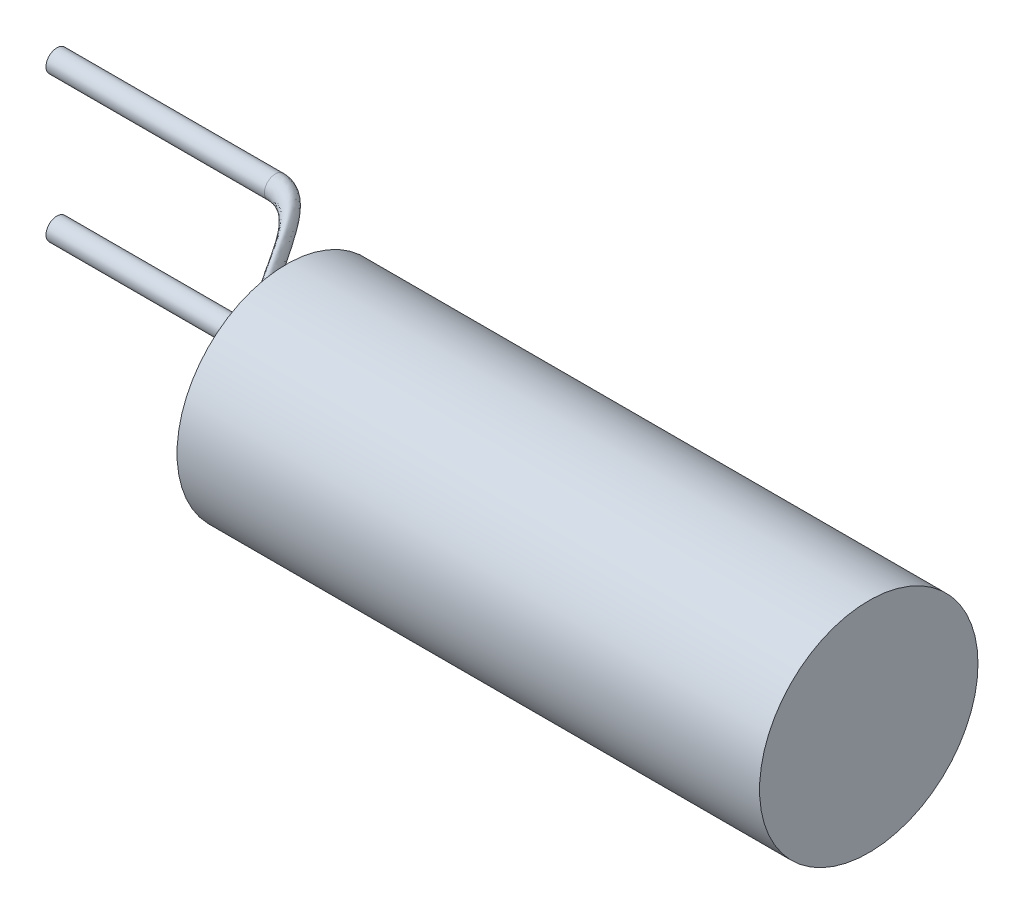
ISO-10303-21;
HEADER;
FILE_DESCRIPTION(('STEP AP214'),'2;1');
FILE_NAME('part.step','',(''),(''),'','','');
FILE_SCHEMA(('AUTOMOTIVE_DESIGN { 1 0 10303 214 1 1 1 1 }'));
ENDSEC;
DATA;
#1=APPLICATION_CONTEXT('core data for automotive mechanical design processes');
#2=APPLICATION_PROTOCOL_DEFINITION('international standard','automotive_design',2000,#1);
#3=PRODUCT_CONTEXT('',#1,'mechanical');
#4=PRODUCT('Part','Part','',(#3));
#5=PRODUCT_RELATED_PRODUCT_CATEGORY('part','',(#4));
#6=PRODUCT_DEFINITION_FORMATION('','',#4);
#7=PRODUCT_DEFINITION_CONTEXT('part definition',#1,'design');
#8=PRODUCT_DEFINITION('design','',#6,#7);
#9=PRODUCT_DEFINITION_SHAPE('','',#8);
#10=(LENGTH_UNIT() NAMED_UNIT(*) SI_UNIT(.MILLI.,.METRE.));
#11=(NAMED_UNIT(*) PLANE_ANGLE_UNIT() SI_UNIT($,.RADIAN.));
#12=(NAMED_UNIT(*) SI_UNIT($,.STERADIAN.) SOLID_ANGLE_UNIT());
#13=UNCERTAINTY_MEASURE_WITH_UNIT(LENGTH_MEASURE(1.E-05),#10,'distance_accuracy_value','');
#14=(GEOMETRIC_REPRESENTATION_CONTEXT(3) GLOBAL_UNCERTAINTY_ASSIGNED_CONTEXT((#13)) GLOBAL_UNIT_ASSIGNED_CONTEXT((#10,
#11,#12)) REPRESENTATION_CONTEXT('',''));
#15=CARTESIAN_POINT('',(0.,0.,0.));
#16=DIRECTION('',(0.,0.,1.));
#17=DIRECTION('',(1.,0.,0.));
#18=AXIS2_PLACEMENT_3D('',#15,#16,#17);
#19=CARTESIAN_POINT('',(-8.5,-1.,0.15));
#20=DIRECTION('',(1.,0.,0.));
#21=DIRECTION('',(0.,0.,-1.));
#22=AXIS2_PLACEMENT_3D('',#19,#20,#21);
#23=CYLINDRICAL_SURFACE('',#22,0.15);
#24=CARTESIAN_POINT('',(-8.5,-1.,0.15));
#25=DIRECTION('',(1.,0.,0.));
#26=DIRECTION('',(0.,0.,-1.));
#27=AXIS2_PLACEMENT_3D('',#24,#25,#26);
#28=CIRCLE('',#27,0.15);
#29=CARTESIAN_POINT('',(-8.5,-1.,0.));
#30=VERTEX_POINT('',#29);
#31=EDGE_CURVE('E11',#30,#30,#28,.T.);
#32=ORIENTED_EDGE('',*,*,#31,.T.);
#33=EDGE_LOOP('',(#32));
#34=FACE_BOUND('',#33,.T.);
#35=CARTESIAN_POINT('',(-5.5,-0.850014330437405,0.147926614878967));
#36=CARTESIAN_POINT('',(-5.5,-0.849957113818923,0.152065581994215));
#37=CARTESIAN_POINT('',(-5.5,-0.850179788616337,0.160270296413231));
#38=CARTESIAN_POINT('',(-5.5,-0.85148693526129,0.172318448293309));
#39=CARTESIAN_POINT('',(-5.5,-0.853729026700765,0.184068420110933));
#40=CARTESIAN_POINT('',(-5.5,-0.872562106178904,0.252543608757904));
#41=CARTESIAN_POINT('',(-5.5,-0.931703141034997,0.299070203666875));
#42=CARTESIAN_POINT('',(-5.5,-1.08070595718393,0.301130001932244));
#43=CARTESIAN_POINT('',(-5.5,-1.14884133719295,0.234852727425996));
#44=CARTESIAN_POINT('',(-5.5,-1.15113000193224,0.069294042816071));
#45=CARTESIAN_POINT('',(-5.5,-1.084852727426,0.0011586628070547));
#46=CARTESIAN_POINT('',(-5.5,-0.935849911277064,-0.000901135458314405));
#47=CARTESIAN_POINT('',(-5.5,-0.875445364679089,0.0439728747030943));
#48=CARTESIAN_POINT('',(-5.5,-0.854726656844276,0.111901303865882));
#49=CARTESIAN_POINT('',(-5.5,-0.852160623644375,0.12358480870625));
#50=CARTESIAN_POINT('',(-5.5,-0.85052093553105,0.135592223872216));
#51=CARTESIAN_POINT('',(-5.5,-0.850071547055888,0.143787647763719));
#52=CARTESIAN_POINT('',(-5.5,-0.850014330437405,0.147926614878967));
#53=B_SPLINE_CURVE_WITH_KNOTS('',3,(#35,#36,#37,#38,#39,#40,#41,#42,#43,#44,#45,#46,#47,#48,#49,
#50,#51,#52),.UNSPECIFIED.,.T.,.F.,(4,1,1,1,1,2,2,2,1,1,1,1,4),(0.,0.0125,0.0249999999999999,
0.0375000000000001,0.05,0.25,0.5,0.75,0.95,0.9625,0.975,0.9875,1.),.UNSPECIFIED.);
#54=CARTESIAN_POINT('',(-5.5,-0.850014330437405,0.147926614878967));
#55=VERTEX_POINT('',#54);
#56=EDGE_CURVE('E116',#55,#55,#53,.T.);
#57=ORIENTED_EDGE('',*,*,#56,.F.);
#58=EDGE_LOOP('',(#57));
#59=FACE_BOUND('',#58,.T.);
#60=ADVANCED_FACE('F107',(#34,#59),#23,.T.);
#61=CARTESIAN_POINT('',(-8.5,-1.,0.15));
#62=DIRECTION('',(1.,0.,0.));
#63=DIRECTION('',(0.,0.,-1.));
#64=AXIS2_PLACEMENT_3D('',#61,#62,#63);
#65=PLANE('',#64);
#66=ORIENTED_EDGE('',*,*,#31,.F.);
#67=EDGE_LOOP('',(#66));
#68=FACE_BOUND('',#67,.T.);
#69=ADVANCED_FACE('F153',(#68),#65,.F.);
#70=CARTESIAN_POINT('',(-5.5,-0.850014330437405,0.147926614878967));
#71=CARTESIAN_POINT('',(-4.86123588419275,-0.850014330437405,0.147926614878967));
#72=CARTESIAN_POINT('',(-4.73876411580726,-0.445545419311715,1.39234666482995));
#73=CARTESIAN_POINT('',(-4.1,-0.445545419311715,1.39234666482995));
#74=CARTESIAN_POINT('',(-5.5,-0.849957113818923,0.152065581994215));
#75=CARTESIAN_POINT('',(-4.86130251137473,-0.849957113818923,0.152065581994215));
#76=CARTESIAN_POINT('',(-4.73869748862527,-0.442574644734284,1.39522916737681));
#77=CARTESIAN_POINT('',(-4.1,-0.442574644734284,1.39522916737681));
#78=CARTESIAN_POINT('',(-5.5,-0.850179788616337,0.160270296413231));
#79=CARTESIAN_POINT('',(-4.86137207730885,-0.850179788616337,0.160270296413231));
#80=CARTESIAN_POINT('',(-4.73862792269115,-0.436923006467813,1.40118113408269));
#81=CARTESIAN_POINT('',(-4.1,-0.436923006467813,1.40118113408269));
#82=CARTESIAN_POINT('',(-5.5,-0.85148693526129,0.172318448293309));
#83=CARTESIAN_POINT('',(-4.86128808028679,-0.85148693526129,0.172318448293309));
#84=CARTESIAN_POINT('',(-4.73871191971321,-0.429316107623629,1.41061520457486));
#85=CARTESIAN_POINT('',(-4.1,-0.429316107623629,1.41061520457486));
#86=CARTESIAN_POINT('',(-5.5,-0.853729026700765,0.184068420110933));
#87=CARTESIAN_POINT('',(-4.86102186682558,-0.853729026700765,0.184068420110933));
#88=CARTESIAN_POINT('',(-4.73897813317443,-0.422580593225315,1.42050063109717));
#89=CARTESIAN_POINT('',(-4.1,-0.422580593225315,1.42050063109717));
#90=CARTESIAN_POINT('',(-5.5,-0.872562106178904,0.252543608757904));
#91=CARTESIAN_POINT('',(-4.85841624381571,-0.872562106178904,0.252543608757904));
#92=CARTESIAN_POINT('',(-4.74158375618426,-0.387400768852726,1.48219273999274));
#93=CARTESIAN_POINT('',(-4.1,-0.387400768852726,1.48219273999274));
#94=CARTESIAN_POINT('',(-5.5,-0.931703141034997,0.299070203666875));
#95=CARTESIAN_POINT('',(-4.84685125030273,-0.931703141034997,0.299070203666875));
#96=CARTESIAN_POINT('',(-4.75314874969727,-0.396226624080282,1.55692218744938));
#97=CARTESIAN_POINT('',(-4.1,-0.396226624080282,1.55692218744938));
#98=CARTESIAN_POINT('',(-5.5,-1.08070595718393,0.301130001932244));
#99=CARTESIAN_POINT('',(-4.82201351547943,-1.08070595718393,0.301130001932244));
#100=CARTESIAN_POINT('',(-4.77798648452058,-0.49999671576704,1.66387007223692));
#101=CARTESIAN_POINT('',(-4.1,-0.49999671576704,1.66387007223692));
#102=CARTESIAN_POINT('',(-5.5,-1.14884133719295,0.234852727425996));
#103=CARTESIAN_POINT('',(-4.80797369035177,-1.14884133719295,0.234852727425996));
#104=CARTESIAN_POINT('',(-4.79202630964824,-0.595039089139653,1.66530338610714));
#105=CARTESIAN_POINT('',(-4.1,-0.595039089139653,1.66530338610714));
#106=CARTESIAN_POINT('',(-5.5,-1.15113000193224,0.069294042816071));
#107=CARTESIAN_POINT('',(-4.80570198475555,-1.15113000193224,0.069294042816071));
#108=CARTESIAN_POINT('',(-4.79429801524445,-0.713870072236917,1.55000328423296));
#109=CARTESIAN_POINT('',(-4.1,-0.713870072236916,1.55000328423296));
#110=CARTESIAN_POINT('',(-5.5,-1.084852727426,0.0011586628070547));
#111=CARTESIAN_POINT('',(-4.817470104287,-1.084852727426,0.0011586628070547));
#112=CARTESIAN_POINT('',(-4.782529895713,-0.715303386107136,1.45496091086035));
#113=CARTESIAN_POINT('',(-4.1,-0.715303386107136,1.45496091086035));
#114=CARTESIAN_POINT('',(-5.5,-0.935849911277064,-0.000901135458314405));
#115=CARTESIAN_POINT('',(-4.84211046922617,-0.935849911277064,-0.000901135458314405));
#116=CARTESIAN_POINT('',(-4.75788953077383,-0.611533294420378,1.34801302607281));
#117=CARTESIAN_POINT('',(-4.1,-0.611533294420378,1.34801302607281));
#118=CARTESIAN_POINT('',(-5.5,-0.875445364679089,0.0439728747030943));
#119=CARTESIAN_POINT('',(-4.85505245814308,-0.875445364679089,0.0439728747030943));
#120=CARTESIAN_POINT('',(-4.74494754185693,-0.537103971867696,1.33693773907779));
#121=CARTESIAN_POINT('',(-4.1,-0.537103971867696,1.33693773907779));
#122=CARTESIAN_POINT('',(-5.5,-0.854726656844276,0.111901303865882));
#123=CARTESIAN_POINT('',(-4.85985516259025,-0.854726656844276,0.111901303865882));
#124=CARTESIAN_POINT('',(-4.74014483740975,-0.47437908021438,1.37024125705935));
#125=CARTESIAN_POINT('',(-4.1,-0.47437908021438,1.37024125705935));
#126=CARTESIAN_POINT('',(-5.5,-0.852160623644375,0.12358480870625));
#127=CARTESIAN_POINT('',(-4.86049972815062,-0.852160623644375,0.12358480870625));
#128=CARTESIAN_POINT('',(-4.73950027184938,-0.46429504162327,1.37667561619068));
#129=CARTESIAN_POINT('',(-4.1,-0.46429504162327,1.37667561619068));
#130=CARTESIAN_POINT('',(-5.5,-0.85052093553105,0.135592223872216));
#131=CARTESIAN_POINT('',(-4.86097231421695,-0.850520935531049,0.135592223872216));
#132=CARTESIAN_POINT('',(-4.73902768578304,-0.45463587745313,1.38399457401343));
#133=CARTESIAN_POINT('',(-4.1,-0.45463587745313,1.38399457401343));
#134=CARTESIAN_POINT('',(-5.5,-0.850071547055888,0.143787647763719));
#135=CARTESIAN_POINT('',(-4.86116925701076,-0.850071547055888,0.143787647763719));
#136=CARTESIAN_POINT('',(-4.73883074298924,-0.448516193889147,1.3894641622831));
#137=CARTESIAN_POINT('',(-4.1,-0.448516193889147,1.3894641622831));
#138=CARTESIAN_POINT('',(-5.5,-0.850014330437405,0.147926614878967));
#139=CARTESIAN_POINT('',(-4.86123588419275,-0.850014330437405,0.147926614878967));
#140=CARTESIAN_POINT('',(-4.73876411580726,-0.445545419311715,1.39234666482995));
#141=CARTESIAN_POINT('',(-4.1,-0.445545419311715,1.39234666482995));
#142=B_SPLINE_SURFACE_WITH_KNOTS('',3,3,((#70,#71,#72,#73),(#74,#75,#76,#77),(#78,#79,#80,#81),
(#82,#83,#84,#85),(#86,#87,#88,#89),(#90,#91,#92,#93),(#94,#95,#96,#97),(#98,#99,#100,#101),
(#102,#103,#104,#105),(#106,#107,#108,#109),(#110,#111,#112,#113),(#114,#115,#116,#117),(#118,
#119,#120,#121),(#122,#123,#124,#125),(#126,#127,#128,#129),(#130,#131,#132,#133),(#134,#135,
#136,#137),(#138,#139,#140,#141)),.UNSPECIFIED.,.T.,.F.,.F.,(4,1,1,1,1,2,2,2,1,1,1,1,4),(4,4),
(0.,0.0125,0.0249999999999999,0.0375000000000001,0.05,0.25,0.5,0.75,0.95,0.9625,0.975,0.9875,
1.),(0.,1.),.UNSPECIFIED.);
#143=CARTESIAN_POINT('',(-4.1,-0.445545419311715,1.39234666482995));
#144=CARTESIAN_POINT('',(-4.1,-0.448516193889147,1.3894641622831));
#145=CARTESIAN_POINT('',(-4.1,-0.45463587745313,1.38399457401343));
#146=CARTESIAN_POINT('',(-4.1,-0.46429504162327,1.37667561619068));
#147=CARTESIAN_POINT('',(-4.1,-0.47437908021438,1.37024125705935));
#148=CARTESIAN_POINT('',(-4.1,-0.537103971867696,1.33693773907779));
#149=CARTESIAN_POINT('',(-4.1,-0.611533294420378,1.34801302607281));
#150=CARTESIAN_POINT('',(-4.1,-0.715303386107136,1.45496091086035));
#151=CARTESIAN_POINT('',(-4.1,-0.713870072236916,1.55000328423296));
#152=CARTESIAN_POINT('',(-4.1,-0.595039089139653,1.66530338610714));
#153=CARTESIAN_POINT('',(-4.1,-0.49999671576704,1.66387007223692));
#154=CARTESIAN_POINT('',(-4.1,-0.396226624080282,1.55692218744938));
#155=CARTESIAN_POINT('',(-4.1,-0.387400768852726,1.48219273999274));
#156=CARTESIAN_POINT('',(-4.1,-0.422580593225315,1.42050063109717));
#157=CARTESIAN_POINT('',(-4.1,-0.429316107623629,1.41061520457486));
#158=CARTESIAN_POINT('',(-4.1,-0.436923006467813,1.40118113408269));
#159=CARTESIAN_POINT('',(-4.1,-0.442574644734284,1.39522916737681));
#160=CARTESIAN_POINT('',(-4.1,-0.445545419311715,1.39234666482995));
#161=B_SPLINE_CURVE_WITH_KNOTS('',3,(#143,#144,#145,#146,#147,#148,#149,#150,#151,#152,#153,
#154,#155,#156,#157,#158,#159,#160),.UNSPECIFIED.,.T.,.F.,(4,1,1,1,1,2,2,2,1,1,1,1,4),(0.,
0.0125,0.025,0.0375,0.05,0.25,0.5,0.75,0.95,0.9625,0.975,0.9875,1.),.UNSPECIFIED.);
#162=CARTESIAN_POINT('',(-4.1,-0.445545419311715,1.39234666482995));
#163=VERTEX_POINT('',#162);
#164=EDGE_CURVE('E318',#163,#163,#161,.T.);
#165=ORIENTED_EDGE('',*,*,#56,.T.);
#166=EDGE_LOOP('',(#165));
#167=FACE_BOUND('',#166,.T.);
#168=ORIENTED_EDGE('',*,*,#164,.T.);
#169=EDGE_LOOP('',(#168));
#170=FACE_BOUND('',#169,.T.);
#171=ADVANCED_FACE('F131',(#167,#170),#142,.T.);
#172=CARTESIAN_POINT('',(-8.5,1.,0.15));
#173=DIRECTION('',(1.,0.,0.));
#174=DIRECTION('',(0.,0.,-1.));
#175=AXIS2_PLACEMENT_3D('',#172,#173,#174);
#176=CYLINDRICAL_SURFACE('',#175,0.15);
#177=CARTESIAN_POINT('',(-8.5,1.,0.15));
#178=DIRECTION('',(1.,0.,0.));
#179=DIRECTION('',(0.,0.,-1.));
#180=AXIS2_PLACEMENT_3D('',#177,#178,#179);
#181=CIRCLE('',#180,0.15);
#182=CARTESIAN_POINT('',(-8.5,1.,0.));
#183=VERTEX_POINT('',#182);
#184=EDGE_CURVE('E299',#183,#183,#181,.T.);
#185=ORIENTED_EDGE('',*,*,#184,.T.);
#186=EDGE_LOOP('',(#185));
#187=FACE_BOUND('',#186,.T.);
#188=CARTESIAN_POINT('',(-5.5,0.857695064202424,0.102573158995693));
#189=CARTESIAN_POINT('',(-5.5,0.8590038434736,0.0986461474930519));
#190=CARTESIAN_POINT('',(-5.5,0.861915603895461,0.0909722583872137));
#191=CARTESIAN_POINT('',(-5.5,0.867116863086403,0.0800263231185634));
#192=CARTESIAN_POINT('',(-5.5,0.873102753755113,0.069669782931794));
#193=CARTESIAN_POINT('',(-5.5,0.913431964151697,0.011213892453107));
#194=CARTESIAN_POINT('',(-5.5,0.984594656962047,-0.0132454041363866));
#195=CARTESIAN_POINT('',(-5.5,1.12596707105713,0.0338706496259374));
#196=CARTESIAN_POINT('',(-5.5,1.16848052122109,0.118886610951482));
#197=CARTESIAN_POINT('',(-5.5,1.11612935037406,0.275967071057132));
#198=CARTESIAN_POINT('',(-5.5,1.03111338904852,0.318480521221089));
#199=CARTESIAN_POINT('',(-5.5,0.889740974953433,0.271364467458765));
#200=CARTESIAN_POINT('',(-5.5,0.847479989732962,0.209103764235398));
#201=CARTESIAN_POINT('',(-5.5,0.850282851307933,0.138141236730667));
#202=CARTESIAN_POINT('',(-5.5,0.851706840362252,0.126264323541159));
#203=CARTESIAN_POINT('',(-5.5,0.854112171566834,0.114386572159981));
#204=CARTESIAN_POINT('',(-5.5,0.856386284931248,0.106500170498334));
#205=CARTESIAN_POINT('',(-5.5,0.857695064202424,0.102573158995693));
#206=B_SPLINE_CURVE_WITH_KNOTS('',3,(#188,#189,#190,#191,#192,#193,#194,#195,#196,#197,#198,
#199,#200,#201,#202,#203,#204,#205),.UNSPECIFIED.,.T.,.F.,(4,1,1,1,1,2,2,2,1,1,1,1,4),(0.,
0.0125,0.0249999999999999,0.0375000000000001,0.05,0.25,0.5,0.75,0.95,0.9625,0.975,0.9875,1.),.UNSPECIFIED.);
#207=CARTESIAN_POINT('',(-5.5,0.857695064202424,0.102573158995693));
#208=VERTEX_POINT('',#207);
#209=EDGE_CURVE('E276',#208,#208,#206,.T.);
#210=ORIENTED_EDGE('',*,*,#209,.F.);
#211=EDGE_LOOP('',(#210));
#212=FACE_BOUND('',#211,.T.);
#213=ADVANCED_FACE('F152',(#187,#212),#176,.T.);
#214=CARTESIAN_POINT('',(-8.5,1.,0.15));
#215=DIRECTION('',(1.,0.,0.));
#216=DIRECTION('',(0.,0.,-1.));
#217=AXIS2_PLACEMENT_3D('',#214,#215,#216);
#218=PLANE('',#217);
#219=ORIENTED_EDGE('',*,*,#184,.F.);
#220=EDGE_LOOP('',(#219));
#221=FACE_BOUND('',#220,.T.);
#222=ADVANCED_FACE('F187',(#221),#218,.F.);
#223=CARTESIAN_POINT('',(-5.5,0.857695064202424,0.102573158995693));
#224=CARTESIAN_POINT('',(-4.85972026914232,0.857695064202424,0.102573158995693));
#225=CARTESIAN_POINT('',(-4.74027973085767,0.48630371252887,1.36419579180896));
#226=CARTESIAN_POINT('',(-4.1,0.48630371252887,1.36419579180896));
#227=CARTESIAN_POINT('',(-5.5,0.8590038434736,0.0986461474930519));
#228=CARTESIAN_POINT('',(-4.8594042488723,0.8590038434736,0.0986461474930519));
#229=CARTESIAN_POINT('',(-4.7405957511277,0.490051331574438,1.36243804495238));
#230=CARTESIAN_POINT('',(-4.1,0.490051331574438,1.36243804495238));
#231=CARTESIAN_POINT('',(-5.5,0.861915603895461,0.0909722583872137));
#232=CARTESIAN_POINT('',(-4.85871236287622,0.861915603895461,0.0909722583872137));
#233=CARTESIAN_POINT('',(-4.74128763712379,0.497618773649112,1.35925987830957));
#234=CARTESIAN_POINT('',(-4.1,0.497618773649112,1.35925987830957));
#235=CARTESIAN_POINT('',(-5.5,0.867116863086403,0.0800263231185634));
#236=CARTESIAN_POINT('',(-4.85752925518339,0.867116863086403,0.0800263231185634));
#237=CARTESIAN_POINT('',(-4.74247074481661,0.509135039433844,1.35548599192386));
#238=CARTESIAN_POINT('',(-4.1,0.509135039433844,1.35548599192386));
#239=CARTESIAN_POINT('',(-5.5,0.873102753755113,0.069669782931794));
#240=CARTESIAN_POINT('',(-4.85620380680294,0.873102753755113,0.069669782931794));
#241=CARTESIAN_POINT('',(-4.74379619319707,0.520764898613399,1.35268685148407));
#242=CARTESIAN_POINT('',(-4.1,0.520764898613399,1.35268685148407));
#243=CARTESIAN_POINT('',(-5.5,0.913431964151697,0.011213892453107));
#244=CARTESIAN_POINT('',(-4.84751050614758,0.913431964151697,0.011213892453107));
#245=CARTESIAN_POINT('',(-4.75248949385243,0.590916558392295,1.34162877872549));
#246=CARTESIAN_POINT('',(-4.1,0.590916558392295,1.34162877872549));
#247=CARTESIAN_POINT('',(-5.5,0.984594656962047,-0.0132454041363866));
#248=CARTESIAN_POINT('',(-4.83267611813924,0.984594656962047,-0.0132454041363866));
#249=CARTESIAN_POINT('',(-4.76732388186076,0.657680258485685,1.37634180779978));
#250=CARTESIAN_POINT('',(-4.1,0.657680258485685,1.37634180779978));
#251=CARTESIAN_POINT('',(-5.5,1.12596707105713,0.0338706496259374));
#252=CARTESIAN_POINT('',(-4.80966226486195,1.12596707105713,0.0338706496259374));
#253=CARTESIAN_POINT('',(-4.79033773513805,0.720959145322733,1.51125609344023));
#254=CARTESIAN_POINT('',(-4.1,0.720959145322733,1.51125609344023));
#255=CARTESIAN_POINT('',(-5.5,1.16848052122109,0.118886610951482));
#256=CARTESIAN_POINT('',(-4.80271022474818,1.16848052122109,0.118886610951482));
#257=CARTESIAN_POINT('',(-4.79728977525181,0.688648668382486,1.60064927105935));
#258=CARTESIAN_POINT('',(-4.1,0.688648668382486,1.60064927105935));
#259=CARTESIAN_POINT('',(-5.5,1.11612935037406,0.275967071057132));
#260=CARTESIAN_POINT('',(-4.81351770771395,1.11612935037406,0.275967071057132));
#261=CARTESIAN_POINT('',(-4.78648229228606,0.538743906559774,1.67095914532273));
#262=CARTESIAN_POINT('',(-4.1,0.538743906559774,1.67095914532273));
#263=CARTESIAN_POINT('',(-5.5,1.03111338904852,0.318480521221089));
#264=CARTESIAN_POINT('',(-4.83127723079347,1.03111338904852,0.318480521221089));
#265=CARTESIAN_POINT('',(-4.76872276920655,0.449350728940654,1.63864866838249));
#266=CARTESIAN_POINT('',(-4.1,0.449350728940654,1.63864866838249));
#267=CARTESIAN_POINT('',(-5.5,0.889740974953433,0.271364467458765));
#268=CARTESIAN_POINT('',(-4.85520577243425,0.889740974953433,0.271364467458765));
#269=CARTESIAN_POINT('',(-4.74479422756575,0.386071842103606,1.50373438274205));
#270=CARTESIAN_POINT('',(-4.1,0.386071842103606,1.50373438274205));
#271=CARTESIAN_POINT('',(-5.5,0.847479989732962,0.209103764235398));
#272=CARTESIAN_POINT('',(-4.86346855713484,0.847479989732962,0.209103764235398));
#273=CARTESIAN_POINT('',(-4.73653144286514,0.402066627110585,1.43020511720611));
#274=CARTESIAN_POINT('',(-4.1,0.402066627110586,1.43020511720611));
#275=CARTESIAN_POINT('',(-5.5,0.850282851307933,0.138141236730667));
#276=CARTESIAN_POINT('',(-4.86173803220626,0.850282851307933,0.138141236730667));
#277=CARTESIAN_POINT('',(-4.73826196779374,0.455421335407184,1.38333496203832));
#278=CARTESIAN_POINT('',(-4.1,0.455421335407184,1.38333496203832));
#279=CARTESIAN_POINT('',(-5.5,0.851706840362252,0.126264323541159));
#280=CARTESIAN_POINT('',(-4.8612685936104,0.851706840362252,0.126264323541159));
#281=CARTESIAN_POINT('',(-4.7387314063896,0.465009268247244,1.37618231528398));
#282=CARTESIAN_POINT('',(-4.1,0.465009268247244,1.37618231528398));
#283=CARTESIAN_POINT('',(-5.5,0.854112171566834,0.114386572159981));
#284=CARTESIAN_POINT('',(-4.86060848449638,0.854112171566835,0.114386572159981));
#285=CARTESIAN_POINT('',(-4.73939151550362,0.475274064912022,1.36974022358115));
#286=CARTESIAN_POINT('',(-4.1,0.475274064912022,1.36974022358115));
#287=CARTESIAN_POINT('',(-5.5,0.856386284931248,0.106500170498334));
#288=CARTESIAN_POINT('',(-4.86003628941235,0.856386284931248,0.106500170498334));
#289=CARTESIAN_POINT('',(-4.73996371058765,0.482556093483302,1.36595353866555));
#290=CARTESIAN_POINT('',(-4.1,0.482556093483302,1.36595353866555));
#291=CARTESIAN_POINT('',(-5.5,0.857695064202424,0.102573158995693));
#292=CARTESIAN_POINT('',(-4.85972026914232,0.857695064202424,0.102573158995693));
#293=CARTESIAN_POINT('',(-4.74027973085767,0.48630371252887,1.36419579180896));
#294=CARTESIAN_POINT('',(-4.1,0.48630371252887,1.36419579180896));
#295=B_SPLINE_SURFACE_WITH_KNOTS('',3,3,((#223,#224,#225,#226),(#227,#228,#229,#230),(#231,#232,
#233,#234),(#235,#236,#237,#238),(#239,#240,#241,#242),(#243,#244,#245,#246),(#247,#248,#249,
#250),(#251,#252,#253,#254),(#255,#256,#257,#258),(#259,#260,#261,#262),(#263,#264,#265,#266),
(#267,#268,#269,#270),(#271,#272,#273,#274),(#275,#276,#277,#278),(#279,#280,#281,#282),(#283,
#284,#285,#286),(#287,#288,#289,#290),(#291,#292,#293,#294)),.UNSPECIFIED.,.T.,.F.,.F.,(4,1,1,1,
1,2,2,2,1,1,1,1,4),(4,4),(0.,0.0125,0.0249999999999999,0.0375000000000001,0.05,0.25,0.5,0.75,
0.95,0.9625,0.975,0.9875,1.),(0.,1.),.UNSPECIFIED.);
#296=CARTESIAN_POINT('',(-4.1,0.48630371252887,1.36419579180896));
#297=CARTESIAN_POINT('',(-4.1,0.482556093483302,1.36595353866555));
#298=CARTESIAN_POINT('',(-4.1,0.475274064912022,1.36974022358115));
#299=CARTESIAN_POINT('',(-4.1,0.465009268247244,1.37618231528398));
#300=CARTESIAN_POINT('',(-4.1,0.455421335407184,1.38333496203832));
#301=CARTESIAN_POINT('',(-4.1,0.402066627110586,1.43020511720611));
#302=CARTESIAN_POINT('',(-4.1,0.386071842103606,1.50373438274205));
#303=CARTESIAN_POINT('',(-4.1,0.449350728940654,1.63864866838249));
#304=CARTESIAN_POINT('',(-4.1,0.538743906559774,1.67095914532273));
#305=CARTESIAN_POINT('',(-4.1,0.688648668382486,1.60064927105935));
#306=CARTESIAN_POINT('',(-4.1,0.720959145322733,1.51125609344023));
#307=CARTESIAN_POINT('',(-4.1,0.657680258485685,1.37634180779978));
#308=CARTESIAN_POINT('',(-4.1,0.590916558392295,1.34162877872549));
#309=CARTESIAN_POINT('',(-4.1,0.520764898613399,1.35268685148407));
#310=CARTESIAN_POINT('',(-4.1,0.509135039433844,1.35548599192386));
#311=CARTESIAN_POINT('',(-4.1,0.497618773649112,1.35925987830957));
#312=CARTESIAN_POINT('',(-4.1,0.490051331574438,1.36243804495238));
#313=CARTESIAN_POINT('',(-4.1,0.48630371252887,1.36419579180896));
#314=B_SPLINE_CURVE_WITH_KNOTS('',3,(#296,#297,#298,#299,#300,#301,#302,#303,#304,#305,#306,
#307,#308,#309,#310,#311,#312,#313),.UNSPECIFIED.,.T.,.F.,(4,1,1,1,1,2,2,2,1,1,1,1,4),(0.,
0.0125,0.025,0.0375,0.05,0.25,0.5,0.75,0.95,0.9625,0.975,0.9875,1.),.UNSPECIFIED.);
#315=CARTESIAN_POINT('',(-4.1,0.48630371252887,1.36419579180896));
#316=VERTEX_POINT('',#315);
#317=EDGE_CURVE('E319',#316,#316,#314,.T.);
#318=ORIENTED_EDGE('',*,*,#209,.T.);
#319=EDGE_LOOP('',(#318));
#320=FACE_BOUND('',#319,.T.);
#321=ORIENTED_EDGE('',*,*,#317,.T.);
#322=EDGE_LOOP('',(#321));
#323=FACE_BOUND('',#322,.T.);
#324=ADVANCED_FACE('F196',(#320,#323),#295,.T.);
#325=CARTESIAN_POINT('',(-4.,0.,1.5));
#326=DIRECTION('',(1.,0.,0.));
#327=DIRECTION('',(0.,0.,-1.));
#328=AXIS2_PLACEMENT_3D('',#325,#326,#327);
#329=CYLINDRICAL_SURFACE('',#328,1.5);
#330=CARTESIAN_POINT('',(-4.,0.,1.5));
#331=DIRECTION('',(1.,0.,0.));
#332=DIRECTION('',(0.,0.,-1.));
#333=AXIS2_PLACEMENT_3D('',#330,#331,#332);
#334=CIRCLE('',#333,1.5);
#335=CARTESIAN_POINT('',(-4.,0.,0.));
#336=VERTEX_POINT('',#335);
#337=EDGE_CURVE('E323',#336,#336,#334,.T.);
#338=ORIENTED_EDGE('',*,*,#337,.T.);
#339=EDGE_LOOP('',(#338));
#340=FACE_BOUND('',#339,.T.);
#341=CARTESIAN_POINT('',(4.,0.,1.5));
#342=DIRECTION('',(1.,0.,0.));
#343=DIRECTION('',(0.,0.,-1.));
#344=AXIS2_PLACEMENT_3D('',#341,#342,#343);
#345=CIRCLE('',#344,1.5);
#346=CARTESIAN_POINT('',(4.,0.,0.));
#347=VERTEX_POINT('',#346);
#348=EDGE_CURVE('E320',#347,#347,#345,.T.);
#349=ORIENTED_EDGE('',*,*,#348,.F.);
#350=EDGE_LOOP('',(#349));
#351=FACE_BOUND('',#350,.T.);
#352=ADVANCED_FACE('F205',(#340,#351),#329,.T.);
#353=CARTESIAN_POINT('',(-4.,0.,1.5));
#354=DIRECTION('',(1.,0.,0.));
#355=DIRECTION('',(0.,0.,-1.));
#356=AXIS2_PLACEMENT_3D('',#353,#354,#355);
#357=PLANE('',#356);
#358=CARTESIAN_POINT('',(-4.,-0.55,1.5));
#359=DIRECTION('',(1.,0.,0.));
#360=DIRECTION('',(0.,0.,-1.));
#361=AXIS2_PLACEMENT_3D('',#358,#359,#360);
#362=CIRCLE('',#361,0.15);
#363=CARTESIAN_POINT('',(-4.,-0.55,1.35));
#364=VERTEX_POINT('',#363);
#365=EDGE_CURVE('E121',#364,#364,#362,.F.);
#366=ORIENTED_EDGE('',*,*,#365,.F.);
#367=EDGE_LOOP('',(#366));
#368=FACE_BOUND('',#367,.T.);
#369=CARTESIAN_POINT('',(-4.,0.55,1.5));
#370=DIRECTION('',(1.,0.,0.));
#371=DIRECTION('',(0.,0.,-1.));
#372=AXIS2_PLACEMENT_3D('',#369,#370,#371);
#373=CIRCLE('',#372,0.15);
#374=CARTESIAN_POINT('',(-4.,0.55,1.35));
#375=VERTEX_POINT('',#374);
#376=EDGE_CURVE('E327',#375,#375,#373,.F.);
#377=ORIENTED_EDGE('',*,*,#376,.F.);
#378=EDGE_LOOP('',(#377));
#379=FACE_BOUND('',#378,.T.);
#380=ORIENTED_EDGE('',*,*,#337,.F.);
#381=EDGE_LOOP('',(#380));
#382=FACE_BOUND('',#381,.T.);
#383=ADVANCED_FACE('F215',(#368,#379,#382),#357,.F.);
#384=CARTESIAN_POINT('',(4.,0.,1.5));
#385=DIRECTION('',(1.,0.,0.));
#386=DIRECTION('',(0.,0.,-1.));
#387=AXIS2_PLACEMENT_3D('',#384,#385,#386);
#388=PLANE('',#387);
#389=ORIENTED_EDGE('',*,*,#348,.T.);
#390=EDGE_LOOP('',(#389));
#391=FACE_BOUND('',#390,.T.);
#392=ADVANCED_FACE('F225',(#391),#388,.T.);
#393=CARTESIAN_POINT('',(-4.1,0.55,1.5));
#394=DIRECTION('',(1.,0.,0.));
#395=DIRECTION('',(0.,0.,-1.));
#396=AXIS2_PLACEMENT_3D('',#393,#394,#395);
#397=CYLINDRICAL_SURFACE('',#396,0.15);
#398=ORIENTED_EDGE('',*,*,#317,.F.);
#399=EDGE_LOOP('',(#398));
#400=FACE_BOUND('',#399,.T.);
#401=ORIENTED_EDGE('',*,*,#376,.T.);
#402=EDGE_LOOP('',(#401));
#403=FACE_BOUND('',#402,.T.);
#404=ADVANCED_FACE('F235',(#400,#403),#397,.T.);
#405=CARTESIAN_POINT('',(-4.1,-0.55,1.5));
#406=DIRECTION('',(1.,0.,0.));
#407=DIRECTION('',(0.,0.,-1.));
#408=AXIS2_PLACEMENT_3D('',#405,#406,#407);
#409=CYLINDRICAL_SURFACE('',#408,0.15);
#410=ORIENTED_EDGE('',*,*,#164,.F.);
#411=EDGE_LOOP('',(#410));
#412=FACE_BOUND('',#411,.T.);
#413=ORIENTED_EDGE('',*,*,#365,.T.);
#414=EDGE_LOOP('',(#413));
#415=FACE_BOUND('',#414,.T.);
#416=ADVANCED_FACE('F245',(#412,#415),#409,.T.);
#417=CLOSED_SHELL('',(#60,#69,#171,#213,#222,#324,#352,#383,#392,#404,#416));
#418=MANIFOLD_SOLID_BREP('B2',#417);
#419=ADVANCED_BREP_SHAPE_REPRESENTATION('',(#18,#418),#14);
#420=SHAPE_DEFINITION_REPRESENTATION(#9,#419);
ENDSEC;
END-ISO-10303-21;
